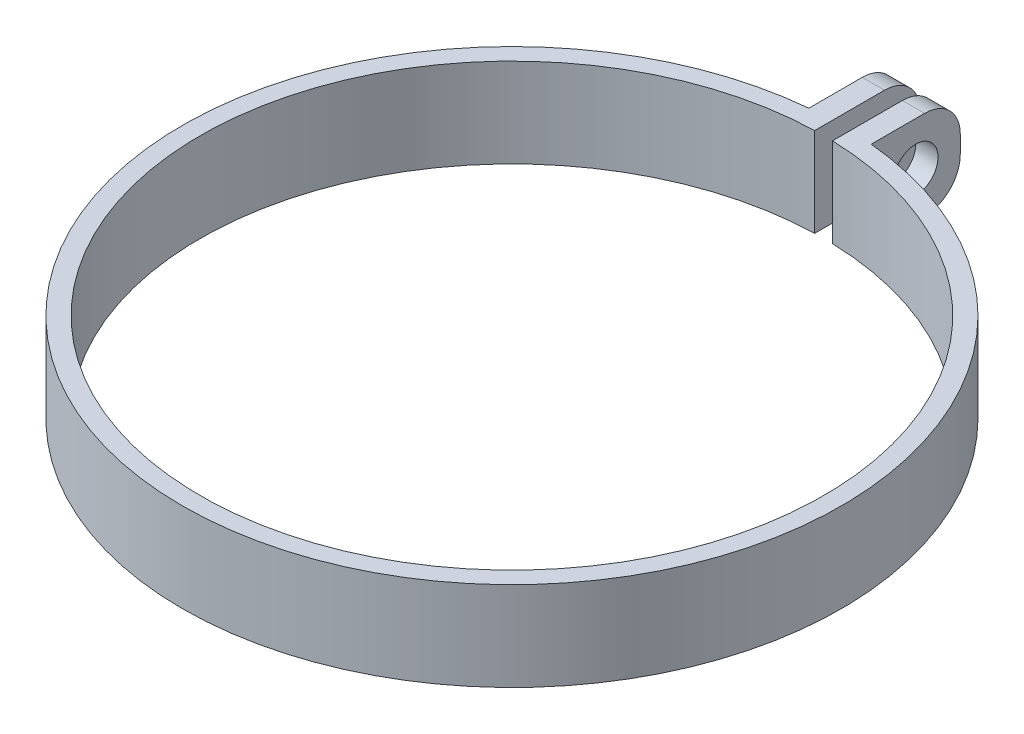
ISO-10303-21;
HEADER;
FILE_DESCRIPTION(('STEP AP214'),'2;1');
FILE_NAME('part.step','',(''),(''),'','','');
FILE_SCHEMA(('AUTOMOTIVE_DESIGN { 1 0 10303 214 1 1 1 1 }'));
ENDSEC;
DATA;
#1=APPLICATION_CONTEXT('core data for automotive mechanical design processes');
#2=APPLICATION_PROTOCOL_DEFINITION('international standard','automotive_design',2000,#1);
#3=PRODUCT_CONTEXT('',#1,'mechanical');
#4=PRODUCT('Part','Part','',(#3));
#5=PRODUCT_RELATED_PRODUCT_CATEGORY('part','',(#4));
#6=PRODUCT_DEFINITION_FORMATION('','',#4);
#7=PRODUCT_DEFINITION_CONTEXT('part definition',#1,'design');
#8=PRODUCT_DEFINITION('design','',#6,#7);
#9=PRODUCT_DEFINITION_SHAPE('','',#8);
#10=(LENGTH_UNIT() NAMED_UNIT(*) SI_UNIT(.MILLI.,.METRE.));
#11=(NAMED_UNIT(*) PLANE_ANGLE_UNIT() SI_UNIT($,.RADIAN.));
#12=(NAMED_UNIT(*) SI_UNIT($,.STERADIAN.) SOLID_ANGLE_UNIT());
#13=UNCERTAINTY_MEASURE_WITH_UNIT(LENGTH_MEASURE(1.E-05),#10,'distance_accuracy_value','');
#14=(GEOMETRIC_REPRESENTATION_CONTEXT(3) GLOBAL_UNCERTAINTY_ASSIGNED_CONTEXT((#13)) GLOBAL_UNIT_ASSIGNED_CONTEXT((#10,
#11,#12)) REPRESENTATION_CONTEXT('',''));
#15=CARTESIAN_POINT('',(0.,0.,0.));
#16=DIRECTION('',(0.,0.,1.));
#17=DIRECTION('',(1.,0.,0.));
#18=AXIS2_PLACEMENT_3D('',#15,#16,#17);
#19=CARTESIAN_POINT('',(0.,10.,0.));
#20=DIRECTION('',(0.,-1.,0.));
#21=DIRECTION('',(0.,0.,-1.));
#22=AXIS2_PLACEMENT_3D('',#19,#20,#21);
#23=CYLINDRICAL_SURFACE('',#22,35.);
#24=CARTESIAN_POINT('',(0.,0.,0.));
#25=DIRECTION('',(0.,-1.,0.));
#26=DIRECTION('',(0.,0.,1.));
#27=AXIS2_PLACEMENT_3D('',#24,#25,#26);
#28=CIRCLE('',#27,35.);
#29=CARTESIAN_POINT('',(1.,0.,-34.9857113690718));
#30=VERTEX_POINT('',#29);
#31=CARTESIAN_POINT('',(-1.,0.,-34.9857113690718));
#32=VERTEX_POINT('',#31);
#33=EDGE_CURVE('E152',#30,#32,#28,.T.);
#34=ORIENTED_EDGE('',*,*,#33,.T.);
#35=DIRECTION('',(0.,-1.,0.));
#36=VECTOR('',#35,1.);
#37=CARTESIAN_POINT('',(-1.,10.,-34.9857113690718));
#38=LINE('',#37,#36);
#39=CARTESIAN_POINT('',(-1.,10.,-34.9857113690718));
#40=VERTEX_POINT('',#39);
#41=EDGE_CURVE('E131',#40,#32,#38,.T.);
#42=ORIENTED_EDGE('',*,*,#41,.F.);
#43=CARTESIAN_POINT('',(0.,10.,0.));
#44=DIRECTION('',(0.,-1.,0.));
#45=DIRECTION('',(0.,0.,1.));
#46=AXIS2_PLACEMENT_3D('',#43,#44,#45);
#47=CIRCLE('',#46,35.);
#48=CARTESIAN_POINT('',(1.,10.,-34.9857113690718));
#49=VERTEX_POINT('',#48);
#50=EDGE_CURVE('E139',#49,#40,#47,.T.);
#51=ORIENTED_EDGE('',*,*,#50,.F.);
#52=DIRECTION('',(0.,-1.,0.));
#53=VECTOR('',#52,1.);
#54=CARTESIAN_POINT('',(1.,10.,-34.9857113690718));
#55=LINE('',#54,#53);
#56=EDGE_CURVE('E222',#49,#30,#55,.T.);
#57=ORIENTED_EDGE('',*,*,#56,.T.);
#58=EDGE_LOOP('',(#34,#42,#51,#57));
#59=FACE_BOUND('',#58,.T.);
#60=ADVANCED_FACE('F35',(#59),#23,.F.);
#61=CARTESIAN_POINT('',(-1.,10.,-34.9857113690718));
#62=DIRECTION('',(-1.,0.,0.));
#63=DIRECTION('',(0.,0.,1.));
#64=AXIS2_PLACEMENT_3D('',#61,#62,#63);
#65=PLANE('',#64);
#66=CARTESIAN_POINT('',(-1.,5.,-41.834087473426));
#67=DIRECTION('',(-1.,0.,0.));
#68=DIRECTION('',(0.,0.,1.));
#69=AXIS2_PLACEMENT_3D('',#66,#67,#68);
#70=CIRCLE('',#69,2.5);
#71=CARTESIAN_POINT('',(-1.,5.,-39.334087473426));
#72=VERTEX_POINT('',#71);
#73=EDGE_CURVE('E231',#72,#72,#70,.T.);
#74=ORIENTED_EDGE('',*,*,#73,.T.);
#75=EDGE_LOOP('',(#74));
#76=FACE_BOUND('',#75,.T.);
#77=DIRECTION('',(0.,-1.,0.));
#78=VECTOR('',#77,1.);
#79=CARTESIAN_POINT('',(-1.,10.,-46.834087473426));
#80=LINE('',#79,#78);
#81=CARTESIAN_POINT('',(-1.,6.,-46.834087473426));
#82=VERTEX_POINT('',#81);
#83=CARTESIAN_POINT('',(-1.,4.,-46.834087473426));
#84=VERTEX_POINT('',#83);
#85=EDGE_CURVE('E154',#82,#84,#80,.T.);
#86=ORIENTED_EDGE('',*,*,#85,.F.);
#87=CARTESIAN_POINT('',(-1.,6.,-42.834087473426));
#88=DIRECTION('',(-1.,0.,0.));
#89=DIRECTION('',(0.,0.,1.));
#90=AXIS2_PLACEMENT_3D('',#87,#88,#89);
#91=CIRCLE('',#90,4.);
#92=CARTESIAN_POINT('',(-1.,10.,-42.834087473426));
#93=VERTEX_POINT('',#92);
#94=EDGE_CURVE('E134',#82,#93,#91,.F.);
#95=ORIENTED_EDGE('',*,*,#94,.T.);
#96=DIRECTION('',(0.,0.,-1.));
#97=VECTOR('',#96,1.);
#98=CARTESIAN_POINT('',(-1.,10.,-34.9857113690718));
#99=LINE('',#98,#97);
#100=EDGE_CURVE('E125',#40,#93,#99,.T.);
#101=ORIENTED_EDGE('',*,*,#100,.F.);
#102=ORIENTED_EDGE('',*,*,#41,.T.);
#103=DIRECTION('',(0.,0.,-1.));
#104=VECTOR('',#103,1.);
#105=CARTESIAN_POINT('',(-1.,0.,-34.9857113690718));
#106=LINE('',#105,#104);
#107=CARTESIAN_POINT('',(-1.,0.,-42.834087473426));
#108=VERTEX_POINT('',#107);
#109=EDGE_CURVE('E195',#32,#108,#106,.T.);
#110=ORIENTED_EDGE('',*,*,#109,.T.);
#111=CARTESIAN_POINT('',(-1.,4.,-42.834087473426));
#112=DIRECTION('',(-1.,0.,0.));
#113=DIRECTION('',(0.,0.,1.));
#114=AXIS2_PLACEMENT_3D('',#111,#112,#113);
#115=CIRCLE('',#114,4.);
#116=EDGE_CURVE('E178',#108,#84,#115,.F.);
#117=ORIENTED_EDGE('',*,*,#116,.T.);
#118=EDGE_LOOP('',(#86,#95,#101,#102,#110,#117));
#119=FACE_BOUND('',#118,.T.);
#120=ADVANCED_FACE('F128',(#76,#119),#65,.F.);
#121=CARTESIAN_POINT('',(-1.,10.,-46.834087473426));
#122=DIRECTION('',(0.,0.,1.));
#123=DIRECTION('',(1.,0.,0.));
#124=AXIS2_PLACEMENT_3D('',#121,#122,#123);
#125=PLANE('',#124);
#126=DIRECTION('',(0.,-1.,0.));
#127=VECTOR('',#126,1.);
#128=CARTESIAN_POINT('',(-3.5,10.,-46.834087473426));
#129=LINE('',#128,#127);
#130=CARTESIAN_POINT('',(-3.5,6.,-46.834087473426));
#131=VERTEX_POINT('',#130);
#132=CARTESIAN_POINT('',(-3.5,4.,-46.834087473426));
#133=VERTEX_POINT('',#132);
#134=EDGE_CURVE('E159',#131,#133,#129,.T.);
#135=ORIENTED_EDGE('',*,*,#134,.F.);
#136=DIRECTION('',(-1.,0.,0.));
#137=VECTOR('',#136,1.);
#138=CARTESIAN_POINT('',(-1.,6.,-46.834087473426));
#139=LINE('',#138,#137);
#140=EDGE_CURVE('E176',#131,#82,#139,.F.);
#141=ORIENTED_EDGE('',*,*,#140,.T.);
#142=ORIENTED_EDGE('',*,*,#85,.T.);
#143=DIRECTION('',(-1.,0.,0.));
#144=VECTOR('',#143,1.);
#145=CARTESIAN_POINT('',(-1.,4.,-46.834087473426));
#146=LINE('',#145,#144);
#147=EDGE_CURVE('E173',#84,#133,#146,.T.);
#148=ORIENTED_EDGE('',*,*,#147,.T.);
#149=EDGE_LOOP('',(#135,#141,#142,#148));
#150=FACE_BOUND('',#149,.T.);
#151=ADVANCED_FACE('F205',(#150),#125,.F.);
#152=CARTESIAN_POINT('',(-3.5,10.,-46.834087473426));
#153=DIRECTION('',(1.,0.,0.));
#154=DIRECTION('',(0.,0.,-1.));
#155=AXIS2_PLACEMENT_3D('',#152,#153,#154);
#156=PLANE('',#155);
#157=CARTESIAN_POINT('',(-3.5,5.,-41.834087473426));
#158=DIRECTION('',(-1.,0.,0.));
#159=DIRECTION('',(0.,0.,1.));
#160=AXIS2_PLACEMENT_3D('',#157,#158,#159);
#161=CIRCLE('',#160,2.5);
#162=CARTESIAN_POINT('',(-3.5,5.,-39.334087473426));
#163=VERTEX_POINT('',#162);
#164=EDGE_CURVE('E166',#163,#163,#161,.T.);
#165=ORIENTED_EDGE('',*,*,#164,.F.);
#166=EDGE_LOOP('',(#165));
#167=FACE_BOUND('',#166,.T.);
#168=DIRECTION('',(0.,0.,1.));
#169=VECTOR('',#168,1.);
#170=CARTESIAN_POINT('',(-3.5,10.,-46.834087473426));
#171=LINE('',#170,#169);
#172=CARTESIAN_POINT('',(-3.5,10.,-42.834087473426));
#173=VERTEX_POINT('',#172);
#174=CARTESIAN_POINT('',(-3.5,10.,-36.834087473426));
#175=VERTEX_POINT('',#174);
#176=EDGE_CURVE('E138',#173,#175,#171,.T.);
#177=ORIENTED_EDGE('',*,*,#176,.F.);
#178=CARTESIAN_POINT('',(-3.5,6.,-42.834087473426));
#179=DIRECTION('',(1.,0.,0.));
#180=DIRECTION('',(0.,0.,-1.));
#181=AXIS2_PLACEMENT_3D('',#178,#179,#180);
#182=CIRCLE('',#181,4.);
#183=EDGE_CURVE('E171',#173,#131,#182,.F.);
#184=ORIENTED_EDGE('',*,*,#183,.T.);
#185=ORIENTED_EDGE('',*,*,#134,.T.);
#186=CARTESIAN_POINT('',(-3.5,4.,-42.834087473426));
#187=DIRECTION('',(1.,0.,0.));
#188=DIRECTION('',(0.,0.,-1.));
#189=AXIS2_PLACEMENT_3D('',#186,#187,#188);
#190=CIRCLE('',#189,4.);
#191=CARTESIAN_POINT('',(-3.5,0.,-42.834087473426));
#192=VERTEX_POINT('',#191);
#193=EDGE_CURVE('E169',#133,#192,#190,.F.);
#194=ORIENTED_EDGE('',*,*,#193,.T.);
#195=DIRECTION('',(0.,0.,1.));
#196=VECTOR('',#195,1.);
#197=CARTESIAN_POINT('',(-3.5,0.,-46.834087473426));
#198=LINE('',#197,#196);
#199=CARTESIAN_POINT('',(-3.5,0.,-36.834087473426));
#200=VERTEX_POINT('',#199);
#201=EDGE_CURVE('E197',#192,#200,#198,.T.);
#202=ORIENTED_EDGE('',*,*,#201,.T.);
#203=DIRECTION('',(0.,-1.,0.));
#204=VECTOR('',#203,1.);
#205=CARTESIAN_POINT('',(-3.5,10.,-36.834087473426));
#206=LINE('',#205,#204);
#207=EDGE_CURVE('E210',#175,#200,#206,.T.);
#208=ORIENTED_EDGE('',*,*,#207,.F.);
#209=EDGE_LOOP('',(#177,#184,#185,#194,#202,#208));
#210=FACE_BOUND('',#209,.T.);
#211=ADVANCED_FACE('F209',(#167,#210),#156,.F.);
#212=CARTESIAN_POINT('',(0.,10.,0.));
#213=DIRECTION('',(0.,-1.,0.));
#214=DIRECTION('',(0.,0.,-1.));
#215=AXIS2_PLACEMENT_3D('',#212,#213,#214);
#216=CYLINDRICAL_SURFACE('',#215,37.);
#217=CARTESIAN_POINT('',(0.,0.,0.));
#218=DIRECTION('',(0.,1.,0.));
#219=DIRECTION('',(0.,0.,1.));
#220=AXIS2_PLACEMENT_3D('',#217,#218,#219);
#221=CIRCLE('',#220,37.);
#222=CARTESIAN_POINT('',(3.50000000000003,0.,-36.834087473426));
#223=VERTEX_POINT('',#222);
#224=EDGE_CURVE('E227',#200,#223,#221,.T.);
#225=ORIENTED_EDGE('',*,*,#224,.T.);
#226=DIRECTION('',(0.,-1.,0.));
#227=VECTOR('',#226,1.);
#228=CARTESIAN_POINT('',(3.50000000000003,10.,-36.834087473426));
#229=LINE('',#228,#227);
#230=CARTESIAN_POINT('',(3.50000000000003,10.,-36.834087473426));
#231=VERTEX_POINT('',#230);
#232=EDGE_CURVE('E212',#231,#223,#229,.T.);
#233=ORIENTED_EDGE('',*,*,#232,.F.);
#234=CARTESIAN_POINT('',(0.,10.,0.));
#235=DIRECTION('',(0.,1.,0.));
#236=DIRECTION('',(0.,0.,1.));
#237=AXIS2_PLACEMENT_3D('',#234,#235,#236);
#238=CIRCLE('',#237,37.);
#239=EDGE_CURVE('E236',#175,#231,#238,.T.);
#240=ORIENTED_EDGE('',*,*,#239,.F.);
#241=ORIENTED_EDGE('',*,*,#207,.T.);
#242=EDGE_LOOP('',(#225,#233,#240,#241));
#243=FACE_BOUND('',#242,.T.);
#244=ADVANCED_FACE('F250',(#243),#216,.T.);
#245=CARTESIAN_POINT('',(3.5,10.,-46.834087473426));
#246=DIRECTION('',(-1.,0.,0.));
#247=DIRECTION('',(0.,0.,1.));
#248=AXIS2_PLACEMENT_3D('',#245,#246,#247);
#249=PLANE('',#248);
#250=CARTESIAN_POINT('',(3.5,5.,-41.834087473426));
#251=DIRECTION('',(-1.,0.,0.));
#252=DIRECTION('',(0.,0.,1.));
#253=AXIS2_PLACEMENT_3D('',#250,#251,#252);
#254=CIRCLE('',#253,2.5);
#255=CARTESIAN_POINT('',(3.5,5.,-39.334087473426));
#256=VERTEX_POINT('',#255);
#257=EDGE_CURVE('E165',#256,#256,#254,.T.);
#258=ORIENTED_EDGE('',*,*,#257,.T.);
#259=EDGE_LOOP('',(#258));
#260=FACE_BOUND('',#259,.T.);
#261=DIRECTION('',(0.,-1.,0.));
#262=VECTOR('',#261,1.);
#263=CARTESIAN_POINT('',(3.5,10.,-46.834087473426));
#264=LINE('',#263,#262);
#265=CARTESIAN_POINT('',(3.5,6.,-46.834087473426));
#266=VERTEX_POINT('',#265);
#267=CARTESIAN_POINT('',(3.5,4.,-46.834087473426));
#268=VERTEX_POINT('',#267);
#269=EDGE_CURVE('E217',#266,#268,#264,.T.);
#270=ORIENTED_EDGE('',*,*,#269,.F.);
#271=CARTESIAN_POINT('',(3.5,6.,-42.834087473426));
#272=DIRECTION('',(-1.,0.,0.));
#273=DIRECTION('',(0.,0.,1.));
#274=AXIS2_PLACEMENT_3D('',#271,#272,#273);
#275=CIRCLE('',#274,4.);
#276=CARTESIAN_POINT('',(3.5,10.,-42.834087473426));
#277=VERTEX_POINT('',#276);
#278=EDGE_CURVE('E191',#266,#277,#275,.F.);
#279=ORIENTED_EDGE('',*,*,#278,.T.);
#280=DIRECTION('',(0.,0.,-1.));
#281=VECTOR('',#280,1.);
#282=CARTESIAN_POINT('',(3.5,10.,-46.834087473426));
#283=LINE('',#282,#281);
#284=EDGE_CURVE('E233',#231,#277,#283,.T.);
#285=ORIENTED_EDGE('',*,*,#284,.F.);
#286=ORIENTED_EDGE('',*,*,#232,.T.);
#287=DIRECTION('',(0.,0.,-1.));
#288=VECTOR('',#287,1.);
#289=CARTESIAN_POINT('',(3.5,0.,-46.834087473426));
#290=LINE('',#289,#288);
#291=CARTESIAN_POINT('',(3.5,0.,-42.834087473426));
#292=VERTEX_POINT('',#291);
#293=EDGE_CURVE('E225',#223,#292,#290,.T.);
#294=ORIENTED_EDGE('',*,*,#293,.T.);
#295=CARTESIAN_POINT('',(3.5,4.,-42.834087473426));
#296=DIRECTION('',(-1.,0.,0.));
#297=DIRECTION('',(0.,0.,1.));
#298=AXIS2_PLACEMENT_3D('',#295,#296,#297);
#299=CIRCLE('',#298,4.);
#300=EDGE_CURVE('E55',#292,#268,#299,.F.);
#301=ORIENTED_EDGE('',*,*,#300,.T.);
#302=EDGE_LOOP('',(#270,#279,#285,#286,#294,#301));
#303=FACE_BOUND('',#302,.T.);
#304=ADVANCED_FACE('F256',(#260,#303),#249,.F.);
#305=CARTESIAN_POINT('',(1.,10.,-46.834087473426));
#306=DIRECTION('',(0.,0.,1.));
#307=DIRECTION('',(1.,0.,0.));
#308=AXIS2_PLACEMENT_3D('',#305,#306,#307);
#309=PLANE('',#308);
#310=DIRECTION('',(0.,-1.,0.));
#311=VECTOR('',#310,1.);
#312=CARTESIAN_POINT('',(1.,10.,-46.834087473426));
#313=LINE('',#312,#311);
#314=CARTESIAN_POINT('',(1.,6.,-46.834087473426));
#315=VERTEX_POINT('',#314);
#316=CARTESIAN_POINT('',(1.,4.,-46.834087473426));
#317=VERTEX_POINT('',#316);
#318=EDGE_CURVE('E219',#315,#317,#313,.T.);
#319=ORIENTED_EDGE('',*,*,#318,.F.);
#320=DIRECTION('',(-1.,0.,0.));
#321=VECTOR('',#320,1.);
#322=CARTESIAN_POINT('',(3.5,6.,-46.834087473426));
#323=LINE('',#322,#321);
#324=EDGE_CURVE('E188',#315,#266,#323,.F.);
#325=ORIENTED_EDGE('',*,*,#324,.T.);
#326=ORIENTED_EDGE('',*,*,#269,.T.);
#327=DIRECTION('',(-1.,0.,0.));
#328=VECTOR('',#327,1.);
#329=CARTESIAN_POINT('',(1.,4.,-46.834087473426));
#330=LINE('',#329,#328);
#331=EDGE_CURVE('E185',#268,#317,#330,.T.);
#332=ORIENTED_EDGE('',*,*,#331,.T.);
#333=EDGE_LOOP('',(#319,#325,#326,#332));
#334=FACE_BOUND('',#333,.T.);
#335=ADVANCED_FACE('F284',(#334),#309,.F.);
#336=CARTESIAN_POINT('',(1.,10.,-34.9857113690718));
#337=DIRECTION('',(1.,0.,0.));
#338=DIRECTION('',(0.,0.,-1.));
#339=AXIS2_PLACEMENT_3D('',#336,#337,#338);
#340=PLANE('',#339);
#341=CARTESIAN_POINT('',(1.,5.,-41.834087473426));
#342=DIRECTION('',(1.,0.,0.));
#343=DIRECTION('',(0.,0.,-1.));
#344=AXIS2_PLACEMENT_3D('',#341,#342,#343);
#345=CIRCLE('',#344,2.5);
#346=CARTESIAN_POINT('',(1.,5.,-44.334087473426));
#347=VERTEX_POINT('',#346);
#348=EDGE_CURVE('E163',#347,#347,#345,.T.);
#349=ORIENTED_EDGE('',*,*,#348,.T.);
#350=EDGE_LOOP('',(#349));
#351=FACE_BOUND('',#350,.T.);
#352=DIRECTION('',(0.,0.,1.));
#353=VECTOR('',#352,1.);
#354=CARTESIAN_POINT('',(1.,10.,-34.9857113690718));
#355=LINE('',#354,#353);
#356=CARTESIAN_POINT('',(1.,10.,-42.834087473426));
#357=VERTEX_POINT('',#356);
#358=EDGE_CURVE('E145',#357,#49,#355,.T.);
#359=ORIENTED_EDGE('',*,*,#358,.F.);
#360=CARTESIAN_POINT('',(1.,6.,-42.834087473426));
#361=DIRECTION('',(1.,0.,0.));
#362=DIRECTION('',(0.,0.,-1.));
#363=AXIS2_PLACEMENT_3D('',#360,#361,#362);
#364=CIRCLE('',#363,4.);
#365=EDGE_CURVE('E183',#357,#315,#364,.F.);
#366=ORIENTED_EDGE('',*,*,#365,.T.);
#367=ORIENTED_EDGE('',*,*,#318,.T.);
#368=CARTESIAN_POINT('',(1.,4.,-42.834087473426));
#369=DIRECTION('',(1.,0.,0.));
#370=DIRECTION('',(0.,0.,-1.));
#371=AXIS2_PLACEMENT_3D('',#368,#369,#370);
#372=CIRCLE('',#371,4.);
#373=CARTESIAN_POINT('',(1.,0.,-42.834087473426));
#374=VERTEX_POINT('',#373);
#375=EDGE_CURVE('E181',#317,#374,#372,.F.);
#376=ORIENTED_EDGE('',*,*,#375,.T.);
#377=DIRECTION('',(0.,0.,1.));
#378=VECTOR('',#377,1.);
#379=CARTESIAN_POINT('',(1.,0.,-34.9857113690718));
#380=LINE('',#379,#378);
#381=EDGE_CURVE('E149',#374,#30,#380,.T.);
#382=ORIENTED_EDGE('',*,*,#381,.T.);
#383=ORIENTED_EDGE('',*,*,#56,.F.);
#384=EDGE_LOOP('',(#359,#366,#367,#376,#382,#383));
#385=FACE_BOUND('',#384,.T.);
#386=ADVANCED_FACE('F287',(#351,#385),#340,.F.);
#387=CARTESIAN_POINT('',(0.,10.,0.));
#388=DIRECTION('',(0.,1.,0.));
#389=DIRECTION('',(0.,0.,1.));
#390=AXIS2_PLACEMENT_3D('',#387,#388,#389);
#391=PLANE('',#390);
#392=ORIENTED_EDGE('',*,*,#100,.T.);
#393=DIRECTION('',(-1.,0.,0.));
#394=VECTOR('',#393,1.);
#395=CARTESIAN_POINT('',(-3.5,10.,-42.834087473426));
#396=LINE('',#395,#394);
#397=EDGE_CURVE('E156',#93,#173,#396,.T.);
#398=ORIENTED_EDGE('',*,*,#397,.T.);
#399=ORIENTED_EDGE('',*,*,#176,.T.);
#400=ORIENTED_EDGE('',*,*,#239,.T.);
#401=ORIENTED_EDGE('',*,*,#284,.T.);
#402=DIRECTION('',(-1.,0.,0.));
#403=VECTOR('',#402,1.);
#404=CARTESIAN_POINT('',(1.,10.,-42.834087473426));
#405=LINE('',#404,#403);
#406=EDGE_CURVE('E153',#277,#357,#405,.T.);
#407=ORIENTED_EDGE('',*,*,#406,.T.);
#408=ORIENTED_EDGE('',*,*,#358,.T.);
#409=ORIENTED_EDGE('',*,*,#50,.T.);
#410=EDGE_LOOP('',(#392,#398,#399,#400,#401,#407,#408,#409));
#411=FACE_BOUND('',#410,.T.);
#412=ADVANCED_FACE('F142',(#411),#391,.T.);
#413=CARTESIAN_POINT('',(0.,0.,0.));
#414=DIRECTION('',(0.,1.,0.));
#415=DIRECTION('',(0.,0.,1.));
#416=AXIS2_PLACEMENT_3D('',#413,#414,#415);
#417=PLANE('',#416);
#418=ORIENTED_EDGE('',*,*,#381,.F.);
#419=DIRECTION('',(-1.,0.,0.));
#420=VECTOR('',#419,1.);
#421=CARTESIAN_POINT('',(0.,0.,-42.834087473426));
#422=LINE('',#421,#420);
#423=EDGE_CURVE('E11',#374,#292,#422,.F.);
#424=ORIENTED_EDGE('',*,*,#423,.T.);
#425=ORIENTED_EDGE('',*,*,#293,.F.);
#426=ORIENTED_EDGE('',*,*,#224,.F.);
#427=ORIENTED_EDGE('',*,*,#201,.F.);
#428=DIRECTION('',(-1.,0.,0.));
#429=VECTOR('',#428,1.);
#430=CARTESIAN_POINT('',(0.,0.,-42.834087473426));
#431=LINE('',#430,#429);
#432=EDGE_CURVE('E43',#192,#108,#431,.F.);
#433=ORIENTED_EDGE('',*,*,#432,.T.);
#434=ORIENTED_EDGE('',*,*,#109,.F.);
#435=ORIENTED_EDGE('',*,*,#33,.F.);
#436=EDGE_LOOP('',(#418,#424,#425,#426,#427,#433,#434,#435));
#437=FACE_BOUND('',#436,.T.);
#438=ADVANCED_FACE('F194',(#437),#417,.F.);
#439=CARTESIAN_POINT('',(6.5,5.,-41.834087473426));
#440=DIRECTION('',(-1.,0.,0.));
#441=DIRECTION('',(0.,0.,1.));
#442=AXIS2_PLACEMENT_3D('',#439,#440,#441);
#443=CYLINDRICAL_SURFACE('',#442,2.5);
#444=ORIENTED_EDGE('',*,*,#348,.F.);
#445=EDGE_LOOP('',(#444));
#446=FACE_BOUND('',#445,.T.);
#447=ORIENTED_EDGE('',*,*,#257,.F.);
#448=EDGE_LOOP('',(#447));
#449=FACE_BOUND('',#448,.T.);
#450=ADVANCED_FACE('F307',(#446,#449),#443,.F.);
#451=ORIENTED_EDGE('',*,*,#164,.T.);
#452=EDGE_LOOP('',(#451));
#453=FACE_BOUND('',#452,.T.);
#454=ORIENTED_EDGE('',*,*,#73,.F.);
#455=EDGE_LOOP('',(#454));
#456=FACE_BOUND('',#455,.T.);
#457=ADVANCED_FACE('F246',(#453,#456),#443,.F.);
#458=CARTESIAN_POINT('',(0.,6.,-42.834087473426));
#459=DIRECTION('',(1.,0.,0.));
#460=DIRECTION('',(0.,0.,-1.));
#461=AXIS2_PLACEMENT_3D('',#458,#459,#460);
#462=CYLINDRICAL_SURFACE('',#461,4.);
#463=ORIENTED_EDGE('',*,*,#94,.F.);
#464=ORIENTED_EDGE('',*,*,#140,.F.);
#465=ORIENTED_EDGE('',*,*,#183,.F.);
#466=ORIENTED_EDGE('',*,*,#397,.F.);
#467=EDGE_LOOP('',(#463,#464,#465,#466));
#468=FACE_BOUND('',#467,.T.);
#469=ADVANCED_FACE('F268',(#468),#462,.T.);
#470=CARTESIAN_POINT('',(0.,6.,-42.834087473426));
#471=DIRECTION('',(1.,0.,0.));
#472=DIRECTION('',(0.,0.,-1.));
#473=AXIS2_PLACEMENT_3D('',#470,#471,#472);
#474=CYLINDRICAL_SURFACE('',#473,4.);
#475=ORIENTED_EDGE('',*,*,#278,.F.);
#476=ORIENTED_EDGE('',*,*,#324,.F.);
#477=ORIENTED_EDGE('',*,*,#365,.F.);
#478=ORIENTED_EDGE('',*,*,#406,.F.);
#479=EDGE_LOOP('',(#475,#476,#477,#478));
#480=FACE_BOUND('',#479,.T.);
#481=ADVANCED_FACE('F271',(#480),#474,.T.);
#482=CARTESIAN_POINT('',(1.,4.,-42.834087473426));
#483=DIRECTION('',(-1.,0.,0.));
#484=DIRECTION('',(0.,0.,1.));
#485=AXIS2_PLACEMENT_3D('',#482,#483,#484);
#486=CYLINDRICAL_SURFACE('',#485,4.);
#487=ORIENTED_EDGE('',*,*,#300,.F.);
#488=ORIENTED_EDGE('',*,*,#423,.F.);
#489=ORIENTED_EDGE('',*,*,#375,.F.);
#490=ORIENTED_EDGE('',*,*,#331,.F.);
#491=EDGE_LOOP('',(#487,#488,#489,#490));
#492=FACE_BOUND('',#491,.T.);
#493=ADVANCED_FACE('F274',(#492),#486,.T.);
#494=CARTESIAN_POINT('',(-1.,4.,-42.834087473426));
#495=DIRECTION('',(-1.,0.,0.));
#496=DIRECTION('',(0.,0.,1.));
#497=AXIS2_PLACEMENT_3D('',#494,#495,#496);
#498=CYLINDRICAL_SURFACE('',#497,4.);
#499=ORIENTED_EDGE('',*,*,#116,.F.);
#500=ORIENTED_EDGE('',*,*,#432,.F.);
#501=ORIENTED_EDGE('',*,*,#193,.F.);
#502=ORIENTED_EDGE('',*,*,#147,.F.);
#503=EDGE_LOOP('',(#499,#500,#501,#502));
#504=FACE_BOUND('',#503,.T.);
#505=ADVANCED_FACE('F37',(#504),#498,.T.);
#506=CLOSED_SHELL('',(#60,#120,#151,#211,#244,#304,#335,#386,#412,#438,#450,#457,#469,#481,#493,#505));
#507=MANIFOLD_SOLID_BREP('B2',#506);
#508=ADVANCED_BREP_SHAPE_REPRESENTATION('',(#18,#507),#14);
#509=SHAPE_DEFINITION_REPRESENTATION(#9,#508);
ENDSEC;
END-ISO-10303-21;
